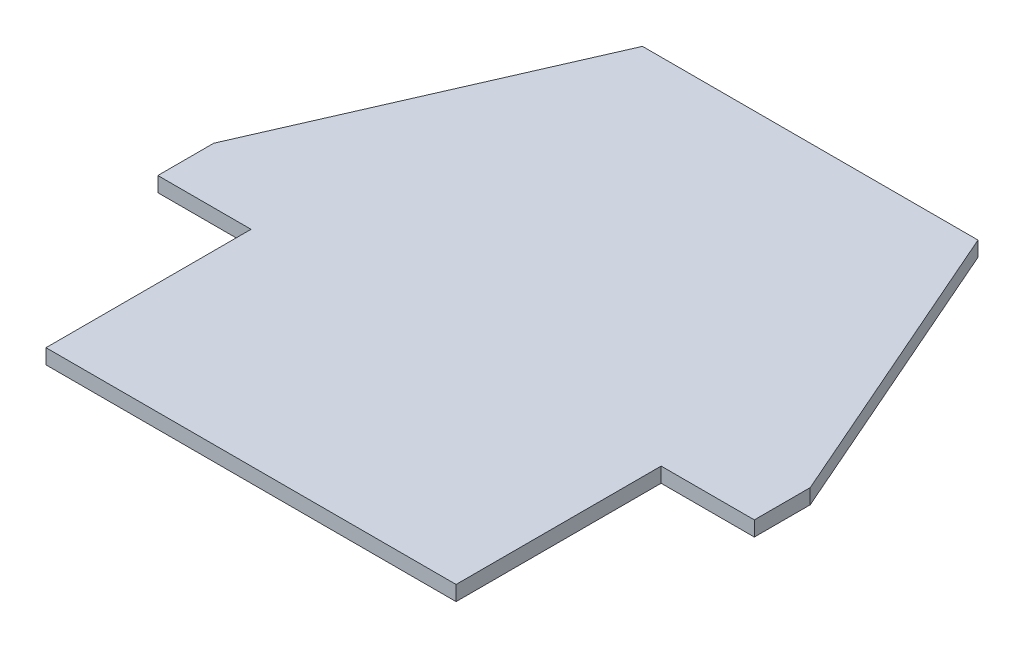
ISO-10303-21;
HEADER;
FILE_DESCRIPTION(('STEP AP214'),'2;1');
FILE_NAME('part.step','',(''),(''),'','','');
FILE_SCHEMA(('AUTOMOTIVE_DESIGN { 1 0 10303 214 1 1 1 1 }'));
ENDSEC;
DATA;
#1=APPLICATION_CONTEXT('core data for automotive mechanical design processes');
#2=APPLICATION_PROTOCOL_DEFINITION('international standard','automotive_design',2000,#1);
#3=PRODUCT_CONTEXT('',#1,'mechanical');
#4=PRODUCT('Part','Part','',(#3));
#5=PRODUCT_RELATED_PRODUCT_CATEGORY('part','',(#4));
#6=PRODUCT_DEFINITION_FORMATION('','',#4);
#7=PRODUCT_DEFINITION_CONTEXT('part definition',#1,'design');
#8=PRODUCT_DEFINITION('design','',#6,#7);
#9=PRODUCT_DEFINITION_SHAPE('','',#8);
#10=(LENGTH_UNIT() NAMED_UNIT(*) SI_UNIT(.MILLI.,.METRE.));
#11=(NAMED_UNIT(*) PLANE_ANGLE_UNIT() SI_UNIT($,.RADIAN.));
#12=(NAMED_UNIT(*) SI_UNIT($,.STERADIAN.) SOLID_ANGLE_UNIT());
#13=UNCERTAINTY_MEASURE_WITH_UNIT(LENGTH_MEASURE(1.E-05),#10,'distance_accuracy_value','');
#14=(GEOMETRIC_REPRESENTATION_CONTEXT(3) GLOBAL_UNCERTAINTY_ASSIGNED_CONTEXT((#13)) GLOBAL_UNIT_ASSIGNED_CONTEXT((#10,
#11,#12)) REPRESENTATION_CONTEXT('',''));
#15=CARTESIAN_POINT('',(0.,0.,0.));
#16=DIRECTION('',(0.,0.,1.));
#17=DIRECTION('',(1.,0.,0.));
#18=AXIS2_PLACEMENT_3D('',#15,#16,#17);
#19=CARTESIAN_POINT('',(0.,2.,0.));
#20=DIRECTION('',(0.,0.,1.));
#21=DIRECTION('',(1.,0.,0.));
#22=AXIS2_PLACEMENT_3D('',#19,#20,#21);
#23=PLANE('',#22);
#24=DIRECTION('',(-1.,0.,0.));
#25=VECTOR('',#24,1.);
#26=CARTESIAN_POINT('',(0.,-2.,0.));
#27=LINE('',#26,#25);
#28=CARTESIAN_POINT('',(55.,-2.,0.));
#29=VERTEX_POINT('',#28);
#30=CARTESIAN_POINT('',(-55.0000000000002,-2.,0.));
#31=VERTEX_POINT('',#30);
#32=EDGE_CURVE('E142',#29,#31,#27,.T.);
#33=ORIENTED_EDGE('',*,*,#32,.F.);
#34=DIRECTION('',(0.,-1.,0.));
#35=VECTOR('',#34,1.);
#36=CARTESIAN_POINT('',(55.,2.,0.));
#37=LINE('',#36,#35);
#38=CARTESIAN_POINT('',(55.,2.,0.));
#39=VERTEX_POINT('',#38);
#40=EDGE_CURVE('E11',#39,#29,#37,.T.);
#41=ORIENTED_EDGE('',*,*,#40,.F.);
#42=DIRECTION('',(-1.,0.,0.));
#43=VECTOR('',#42,1.);
#44=CARTESIAN_POINT('',(0.,2.,0.));
#45=LINE('',#44,#43);
#46=CARTESIAN_POINT('',(-55.0000000000002,2.,0.));
#47=VERTEX_POINT('',#46);
#48=EDGE_CURVE('E165',#39,#47,#45,.T.);
#49=ORIENTED_EDGE('',*,*,#48,.T.);
#50=DIRECTION('',(0.,-1.,0.));
#51=VECTOR('',#50,1.);
#52=CARTESIAN_POINT('',(-55.0000000000002,2.,0.));
#53=LINE('',#52,#51);
#54=EDGE_CURVE('E93',#47,#31,#53,.T.);
#55=ORIENTED_EDGE('',*,*,#54,.T.);
#56=EDGE_LOOP('',(#33,#41,#49,#55));
#57=FACE_BOUND('',#56,.T.);
#58=ADVANCED_FACE('F37',(#57),#23,.T.);
#59=CARTESIAN_POINT('',(55.,2.,0.));
#60=DIRECTION('',(1.,0.,0.));
#61=DIRECTION('',(0.,0.,-1.));
#62=AXIS2_PLACEMENT_3D('',#59,#60,#61);
#63=PLANE('',#62);
#64=DIRECTION('',(0.,0.,1.));
#65=VECTOR('',#64,1.);
#66=CARTESIAN_POINT('',(55.,-2.,0.));
#67=LINE('',#66,#65);
#68=CARTESIAN_POINT('',(55.,-2.,-55.));
#69=VERTEX_POINT('',#68);
#70=EDGE_CURVE('E145',#69,#29,#67,.T.);
#71=ORIENTED_EDGE('',*,*,#70,.F.);
#72=DIRECTION('',(0.,-1.,0.));
#73=VECTOR('',#72,1.);
#74=CARTESIAN_POINT('',(55.,2.,-55.));
#75=LINE('',#74,#73);
#76=CARTESIAN_POINT('',(55.,2.,-55.));
#77=VERTEX_POINT('',#76);
#78=EDGE_CURVE('E45',#77,#69,#75,.T.);
#79=ORIENTED_EDGE('',*,*,#78,.F.);
#80=DIRECTION('',(0.,0.,1.));
#81=VECTOR('',#80,1.);
#82=CARTESIAN_POINT('',(55.,2.,0.));
#83=LINE('',#82,#81);
#84=EDGE_CURVE('E209',#77,#39,#83,.T.);
#85=ORIENTED_EDGE('',*,*,#84,.T.);
#86=ORIENTED_EDGE('',*,*,#40,.T.);
#87=EDGE_LOOP('',(#71,#79,#85,#86));
#88=FACE_BOUND('',#87,.T.);
#89=ADVANCED_FACE('F188',(#88),#63,.T.);
#90=CARTESIAN_POINT('',(0.,2.,-55.));
#91=DIRECTION('',(0.,0.,1.));
#92=DIRECTION('',(1.,0.,0.));
#93=AXIS2_PLACEMENT_3D('',#90,#91,#92);
#94=PLANE('',#93);
#95=DIRECTION('',(-1.,0.,0.));
#96=VECTOR('',#95,1.);
#97=CARTESIAN_POINT('',(0.,-2.,-55.));
#98=LINE('',#97,#96);
#99=CARTESIAN_POINT('',(80.,-2.,-55.));
#100=VERTEX_POINT('',#99);
#101=EDGE_CURVE('E148',#100,#69,#98,.T.);
#102=ORIENTED_EDGE('',*,*,#101,.F.);
#103=DIRECTION('',(0.,-1.,0.));
#104=VECTOR('',#103,1.);
#105=CARTESIAN_POINT('',(80.,2.,-55.));
#106=LINE('',#105,#104);
#107=CARTESIAN_POINT('',(80.,2.,-55.));
#108=VERTEX_POINT('',#107);
#109=EDGE_CURVE('E177',#108,#100,#106,.T.);
#110=ORIENTED_EDGE('',*,*,#109,.F.);
#111=DIRECTION('',(-1.,0.,0.));
#112=VECTOR('',#111,1.);
#113=CARTESIAN_POINT('',(0.,2.,-55.));
#114=LINE('',#113,#112);
#115=EDGE_CURVE('E184',#108,#77,#114,.T.);
#116=ORIENTED_EDGE('',*,*,#115,.T.);
#117=ORIENTED_EDGE('',*,*,#78,.T.);
#118=EDGE_LOOP('',(#102,#110,#116,#117));
#119=FACE_BOUND('',#118,.T.);
#120=ADVANCED_FACE('F182',(#119),#94,.T.);
#121=CARTESIAN_POINT('',(80.,2.,0.));
#122=DIRECTION('',(-1.,0.,0.));
#123=DIRECTION('',(0.,0.,1.));
#124=AXIS2_PLACEMENT_3D('',#121,#122,#123);
#125=PLANE('',#124);
#126=DIRECTION('',(0.,0.,-1.));
#127=VECTOR('',#126,1.);
#128=CARTESIAN_POINT('',(80.,-2.,0.));
#129=LINE('',#128,#127);
#130=CARTESIAN_POINT('',(80.,-2.,-70.));
#131=VERTEX_POINT('',#130);
#132=EDGE_CURVE('E151',#100,#131,#129,.T.);
#133=ORIENTED_EDGE('',*,*,#132,.T.);
#134=DIRECTION('',(0.,-1.,0.));
#135=VECTOR('',#134,1.);
#136=CARTESIAN_POINT('',(80.,2.,-70.));
#137=LINE('',#136,#135);
#138=CARTESIAN_POINT('',(80.,2.,-70.));
#139=VERTEX_POINT('',#138);
#140=EDGE_CURVE('E174',#139,#131,#137,.T.);
#141=ORIENTED_EDGE('',*,*,#140,.F.);
#142=DIRECTION('',(0.,0.,-1.));
#143=VECTOR('',#142,1.);
#144=CARTESIAN_POINT('',(80.,2.,0.));
#145=LINE('',#144,#143);
#146=EDGE_CURVE('E204',#108,#139,#145,.T.);
#147=ORIENTED_EDGE('',*,*,#146,.F.);
#148=ORIENTED_EDGE('',*,*,#109,.T.);
#149=EDGE_LOOP('',(#133,#141,#147,#148));
#150=FACE_BOUND('',#149,.T.);
#151=ADVANCED_FACE('F196',(#150),#125,.F.);
#152=CARTESIAN_POINT('',(92.8524590163934,2.,-40.6229508196721));
#153=DIRECTION('',(-0.916157334902189,0.,0.400818834019708));
#154=DIRECTION('',(0.400818834019708,0.,0.916157334902189));
#155=AXIS2_PLACEMENT_3D('',#152,#153,#154);
#156=PLANE('',#155);
#157=DIRECTION('',(-0.400818834019708,0.,-0.916157334902189));
#158=VECTOR('',#157,1.);
#159=CARTESIAN_POINT('',(92.8524590163934,-2.,-40.6229508196721));
#160=LINE('',#159,#158);
#161=CARTESIAN_POINT('',(45.,-2.,-150.));
#162=VERTEX_POINT('',#161);
#163=EDGE_CURVE('E153',#131,#162,#160,.T.);
#164=ORIENTED_EDGE('',*,*,#163,.T.);
#165=DIRECTION('',(0.,-1.,0.));
#166=VECTOR('',#165,1.);
#167=CARTESIAN_POINT('',(45.,2.,-150.));
#168=LINE('',#167,#166);
#169=CARTESIAN_POINT('',(45.,2.,-150.));
#170=VERTEX_POINT('',#169);
#171=EDGE_CURVE('E171',#170,#162,#168,.T.);
#172=ORIENTED_EDGE('',*,*,#171,.F.);
#173=DIRECTION('',(-0.400818834019708,0.,-0.916157334902189));
#174=VECTOR('',#173,1.);
#175=CARTESIAN_POINT('',(92.8524590163934,2.,-40.6229508196721));
#176=LINE('',#175,#174);
#177=EDGE_CURVE('E202',#139,#170,#176,.T.);
#178=ORIENTED_EDGE('',*,*,#177,.F.);
#179=ORIENTED_EDGE('',*,*,#140,.T.);
#180=EDGE_LOOP('',(#164,#172,#178,#179));
#181=FACE_BOUND('',#180,.T.);
#182=ADVANCED_FACE('F200',(#181),#156,.F.);
#183=CARTESIAN_POINT('',(0.,2.,-150.));
#184=DIRECTION('',(0.,0.,1.));
#185=DIRECTION('',(1.,0.,0.));
#186=AXIS2_PLACEMENT_3D('',#183,#184,#185);
#187=PLANE('',#186);
#188=DIRECTION('',(-1.,0.,0.));
#189=VECTOR('',#188,1.);
#190=CARTESIAN_POINT('',(0.,-2.,-150.));
#191=LINE('',#190,#189);
#192=CARTESIAN_POINT('',(-45.,-2.,-150.));
#193=VERTEX_POINT('',#192);
#194=EDGE_CURVE('E155',#162,#193,#191,.T.);
#195=ORIENTED_EDGE('',*,*,#194,.T.);
#196=DIRECTION('',(0.,-1.,0.));
#197=VECTOR('',#196,1.);
#198=CARTESIAN_POINT('',(-45.,2.,-150.));
#199=LINE('',#198,#197);
#200=CARTESIAN_POINT('',(-45.,2.,-150.));
#201=VERTEX_POINT('',#200);
#202=EDGE_CURVE('E169',#201,#193,#199,.T.);
#203=ORIENTED_EDGE('',*,*,#202,.F.);
#204=DIRECTION('',(-1.,0.,0.));
#205=VECTOR('',#204,1.);
#206=CARTESIAN_POINT('',(0.,2.,-150.));
#207=LINE('',#206,#205);
#208=EDGE_CURVE('E137',#170,#201,#207,.T.);
#209=ORIENTED_EDGE('',*,*,#208,.F.);
#210=ORIENTED_EDGE('',*,*,#171,.T.);
#211=EDGE_LOOP('',(#195,#203,#209,#210));
#212=FACE_BOUND('',#211,.T.);
#213=ADVANCED_FACE('F224',(#212),#187,.F.);
#214=CARTESIAN_POINT('',(-92.8524590163934,2.,-40.6229508196721));
#215=DIRECTION('',(-0.916157334902189,0.,-0.400818834019708));
#216=DIRECTION('',(-0.400818834019708,0.,0.916157334902189));
#217=AXIS2_PLACEMENT_3D('',#214,#215,#216);
#218=PLANE('',#217);
#219=DIRECTION('',(0.400818834019708,0.,-0.916157334902189));
#220=VECTOR('',#219,1.);
#221=CARTESIAN_POINT('',(-92.8524590163934,-2.,-40.6229508196721));
#222=LINE('',#221,#220);
#223=CARTESIAN_POINT('',(-80.,-2.,-70.));
#224=VERTEX_POINT('',#223);
#225=EDGE_CURVE('E158',#224,#193,#222,.T.);
#226=ORIENTED_EDGE('',*,*,#225,.F.);
#227=DIRECTION('',(0.,-1.,0.));
#228=VECTOR('',#227,1.);
#229=CARTESIAN_POINT('',(-80.,2.,-70.));
#230=LINE('',#229,#228);
#231=CARTESIAN_POINT('',(-80.,2.,-70.));
#232=VERTEX_POINT('',#231);
#233=EDGE_CURVE('E126',#232,#224,#230,.T.);
#234=ORIENTED_EDGE('',*,*,#233,.F.);
#235=DIRECTION('',(0.400818834019708,0.,-0.916157334902189));
#236=VECTOR('',#235,1.);
#237=CARTESIAN_POINT('',(-92.8524590163934,2.,-40.6229508196721));
#238=LINE('',#237,#236);
#239=EDGE_CURVE('E135',#232,#201,#238,.T.);
#240=ORIENTED_EDGE('',*,*,#239,.T.);
#241=ORIENTED_EDGE('',*,*,#202,.T.);
#242=EDGE_LOOP('',(#226,#234,#240,#241));
#243=FACE_BOUND('',#242,.T.);
#244=ADVANCED_FACE('F227',(#243),#218,.T.);
#245=CARTESIAN_POINT('',(-80.,2.,0.));
#246=DIRECTION('',(-1.,0.,0.));
#247=DIRECTION('',(0.,0.,1.));
#248=AXIS2_PLACEMENT_3D('',#245,#246,#247);
#249=PLANE('',#248);
#250=DIRECTION('',(0.,0.,-1.));
#251=VECTOR('',#250,1.);
#252=CARTESIAN_POINT('',(-80.,-2.,0.));
#253=LINE('',#252,#251);
#254=CARTESIAN_POINT('',(-80.,-2.,-54.9999999999996));
#255=VERTEX_POINT('',#254);
#256=EDGE_CURVE('E125',#255,#224,#253,.T.);
#257=ORIENTED_EDGE('',*,*,#256,.F.);
#258=DIRECTION('',(0.,-1.,0.));
#259=VECTOR('',#258,1.);
#260=CARTESIAN_POINT('',(-80.,2.,-54.9999999999996));
#261=LINE('',#260,#259);
#262=CARTESIAN_POINT('',(-80.,2.,-54.9999999999996));
#263=VERTEX_POINT('',#262);
#264=EDGE_CURVE('E119',#263,#255,#261,.T.);
#265=ORIENTED_EDGE('',*,*,#264,.F.);
#266=DIRECTION('',(0.,0.,-1.));
#267=VECTOR('',#266,1.);
#268=CARTESIAN_POINT('',(-80.,2.,0.));
#269=LINE('',#268,#267);
#270=EDGE_CURVE('E123',#263,#232,#269,.T.);
#271=ORIENTED_EDGE('',*,*,#270,.T.);
#272=ORIENTED_EDGE('',*,*,#233,.T.);
#273=EDGE_LOOP('',(#257,#265,#271,#272));
#274=FACE_BOUND('',#273,.T.);
#275=ADVANCED_FACE('F121',(#274),#249,.T.);
#276=CARTESIAN_POINT('',(-4.8849813083507E-13,2.,-55.0000000000002));
#277=DIRECTION('',(0.,0.,-1.));
#278=DIRECTION('',(-1.,0.,0.));
#279=AXIS2_PLACEMENT_3D('',#276,#277,#278);
#280=PLANE('',#279);
#281=DIRECTION('',(1.,0.,0.));
#282=VECTOR('',#281,1.);
#283=CARTESIAN_POINT('',(-4.8849813083507E-13,-2.,-55.0000000000002));
#284=LINE('',#283,#282);
#285=CARTESIAN_POINT('',(-55.0000000000004,-2.,-54.9999999999997));
#286=VERTEX_POINT('',#285);
#287=EDGE_CURVE('E86',#255,#286,#284,.T.);
#288=ORIENTED_EDGE('',*,*,#287,.T.);
#289=DIRECTION('',(0.,-1.,0.));
#290=VECTOR('',#289,1.);
#291=CARTESIAN_POINT('',(-55.0000000000004,2.,-54.9999999999997));
#292=LINE('',#291,#290);
#293=CARTESIAN_POINT('',(-55.0000000000004,2.,-54.9999999999997));
#294=VERTEX_POINT('',#293);
#295=EDGE_CURVE('E127',#294,#286,#292,.T.);
#296=ORIENTED_EDGE('',*,*,#295,.F.);
#297=DIRECTION('',(1.,0.,0.));
#298=VECTOR('',#297,1.);
#299=CARTESIAN_POINT('',(-4.8849813083507E-13,2.,-55.0000000000002));
#300=LINE('',#299,#298);
#301=EDGE_CURVE('E129',#263,#294,#300,.T.);
#302=ORIENTED_EDGE('',*,*,#301,.F.);
#303=ORIENTED_EDGE('',*,*,#264,.T.);
#304=EDGE_LOOP('',(#288,#296,#302,#303));
#305=FACE_BOUND('',#304,.T.);
#306=ADVANCED_FACE('F130',(#305),#280,.F.);
#307=CARTESIAN_POINT('',(-55.,2.,3.67761376907083E-13));
#308=DIRECTION('',(1.,0.,0.));
#309=DIRECTION('',(0.,0.,-1.));
#310=AXIS2_PLACEMENT_3D('',#307,#308,#309);
#311=PLANE('',#310);
#312=DIRECTION('',(0.,0.,1.));
#313=VECTOR('',#312,1.);
#314=CARTESIAN_POINT('',(-55.,-2.,3.67761376907083E-13));
#315=LINE('',#314,#313);
#316=EDGE_CURVE('E163',#286,#31,#315,.T.);
#317=ORIENTED_EDGE('',*,*,#316,.T.);
#318=ORIENTED_EDGE('',*,*,#54,.F.);
#319=DIRECTION('',(0.,0.,1.));
#320=VECTOR('',#319,1.);
#321=CARTESIAN_POINT('',(-55.,2.,3.67761376907083E-13));
#322=LINE('',#321,#320);
#323=EDGE_CURVE('E53',#294,#47,#322,.T.);
#324=ORIENTED_EDGE('',*,*,#323,.F.);
#325=ORIENTED_EDGE('',*,*,#295,.T.);
#326=EDGE_LOOP('',(#317,#318,#324,#325));
#327=FACE_BOUND('',#326,.T.);
#328=ADVANCED_FACE('F236',(#327),#311,.F.);
#329=CARTESIAN_POINT('',(0.,2.,0.));
#330=DIRECTION('',(0.,1.,0.));
#331=DIRECTION('',(0.,0.,1.));
#332=AXIS2_PLACEMENT_3D('',#329,#330,#331);
#333=PLANE('',#332);
#334=ORIENTED_EDGE('',*,*,#48,.F.);
#335=ORIENTED_EDGE('',*,*,#84,.F.);
#336=ORIENTED_EDGE('',*,*,#115,.F.);
#337=ORIENTED_EDGE('',*,*,#146,.T.);
#338=ORIENTED_EDGE('',*,*,#177,.T.);
#339=ORIENTED_EDGE('',*,*,#208,.T.);
#340=ORIENTED_EDGE('',*,*,#239,.F.);
#341=ORIENTED_EDGE('',*,*,#270,.F.);
#342=ORIENTED_EDGE('',*,*,#301,.T.);
#343=ORIENTED_EDGE('',*,*,#323,.T.);
#344=EDGE_LOOP('',(#334,#335,#336,#337,#338,#339,#340,#341,#342,#343));
#345=FACE_BOUND('',#344,.T.);
#346=ADVANCED_FACE('F133',(#345),#333,.T.);
#347=CARTESIAN_POINT('',(0.,-2.,0.));
#348=DIRECTION('',(0.,1.,0.));
#349=DIRECTION('',(0.,0.,1.));
#350=AXIS2_PLACEMENT_3D('',#347,#348,#349);
#351=PLANE('',#350);
#352=ORIENTED_EDGE('',*,*,#32,.T.);
#353=ORIENTED_EDGE('',*,*,#316,.F.);
#354=ORIENTED_EDGE('',*,*,#287,.F.);
#355=ORIENTED_EDGE('',*,*,#256,.T.);
#356=ORIENTED_EDGE('',*,*,#225,.T.);
#357=ORIENTED_EDGE('',*,*,#194,.F.);
#358=ORIENTED_EDGE('',*,*,#163,.F.);
#359=ORIENTED_EDGE('',*,*,#132,.F.);
#360=ORIENTED_EDGE('',*,*,#101,.T.);
#361=ORIENTED_EDGE('',*,*,#70,.T.);
#362=EDGE_LOOP('',(#352,#353,#354,#355,#356,#357,#358,#359,#360,#361));
#363=FACE_BOUND('',#362,.T.);
#364=ADVANCED_FACE('F191',(#363),#351,.F.);
#365=CLOSED_SHELL('',(#58,#89,#120,#151,#182,#213,#244,#275,#306,#328,#346,#364));
#366=MANIFOLD_SOLID_BREP('B2',#365);
#367=ADVANCED_BREP_SHAPE_REPRESENTATION('',(#18,#366),#14);
#368=SHAPE_DEFINITION_REPRESENTATION(#9,#367);
ENDSEC;
END-ISO-10303-21;
